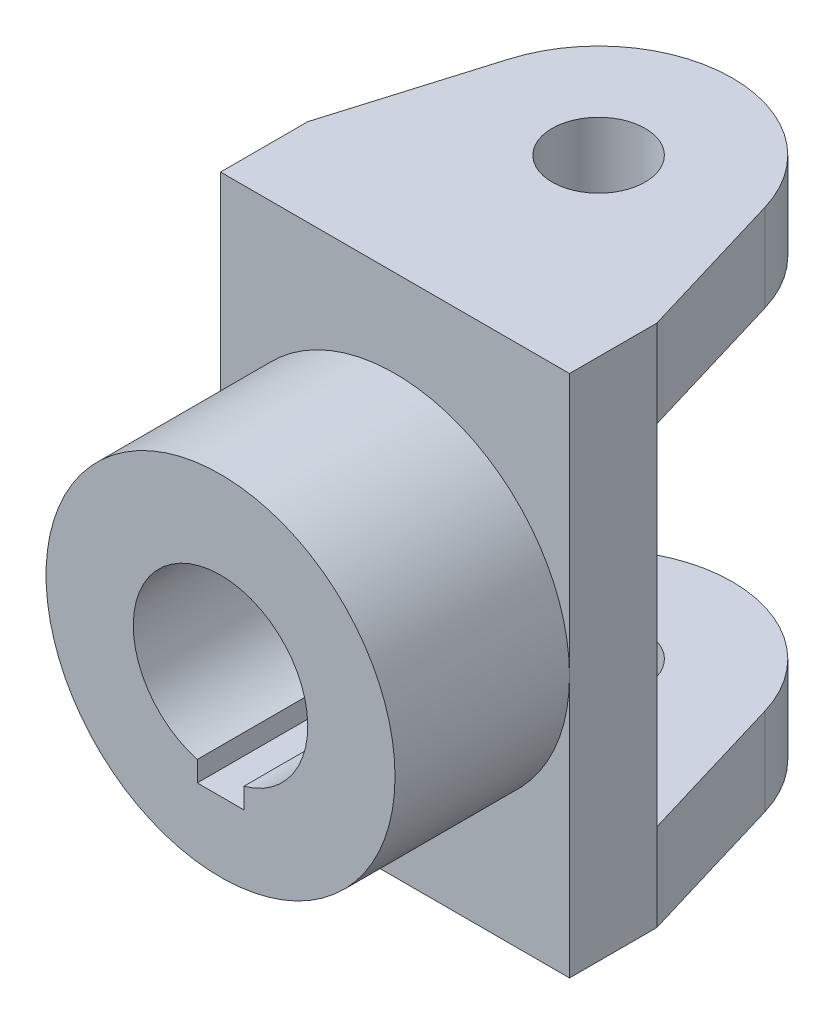
ISO-10303-21;
HEADER;
FILE_DESCRIPTION(('STEP AP214'),'2;1');
FILE_NAME('part.step','',(''),(''),'','','');
FILE_SCHEMA(('AUTOMOTIVE_DESIGN { 1 0 10303 214 1 1 1 1 }'));
ENDSEC;
DATA;
#1=APPLICATION_CONTEXT('core data for automotive mechanical design processes');
#2=APPLICATION_PROTOCOL_DEFINITION('international standard','automotive_design',2000,#1);
#3=PRODUCT_CONTEXT('',#1,'mechanical');
#4=PRODUCT('Part','Part','',(#3));
#5=PRODUCT_RELATED_PRODUCT_CATEGORY('part','',(#4));
#6=PRODUCT_DEFINITION_FORMATION('','',#4);
#7=PRODUCT_DEFINITION_CONTEXT('part definition',#1,'design');
#8=PRODUCT_DEFINITION('design','',#6,#7);
#9=PRODUCT_DEFINITION_SHAPE('','',#8);
#10=(LENGTH_UNIT() NAMED_UNIT(*) SI_UNIT(.MILLI.,.METRE.));
#11=(NAMED_UNIT(*) PLANE_ANGLE_UNIT() SI_UNIT($,.RADIAN.));
#12=(NAMED_UNIT(*) SI_UNIT($,.STERADIAN.) SOLID_ANGLE_UNIT());
#13=UNCERTAINTY_MEASURE_WITH_UNIT(LENGTH_MEASURE(1.E-05),#10,'distance_accuracy_value','');
#14=(GEOMETRIC_REPRESENTATION_CONTEXT(3) GLOBAL_UNCERTAINTY_ASSIGNED_CONTEXT((#13)) GLOBAL_UNIT_ASSIGNED_CONTEXT((#10,
#11,#12)) REPRESENTATION_CONTEXT('',''));
#15=CARTESIAN_POINT('',(0.,0.,0.));
#16=DIRECTION('',(0.,0.,1.));
#17=DIRECTION('',(1.,0.,0.));
#18=AXIS2_PLACEMENT_3D('',#15,#16,#17);
#19=CARTESIAN_POINT('',(0.,0.,-45.));
#20=DIRECTION('',(0.,0.,1.));
#21=DIRECTION('',(1.,0.,0.));
#22=AXIS2_PLACEMENT_3D('',#19,#20,#21);
#23=PLANE('',#22);
#24=DIRECTION('',(1.,0.,0.));
#25=VECTOR('',#24,1.);
#26=CARTESIAN_POINT('',(0.,-30.,-45.));
#27=LINE('',#26,#25);
#28=CARTESIAN_POINT('',(-30.,-30.,-45.));
#29=VERTEX_POINT('',#28);
#30=CARTESIAN_POINT('',(30.,-30.,-45.));
#31=VERTEX_POINT('',#30);
#32=EDGE_CURVE('E11',#29,#31,#27,.T.);
#33=ORIENTED_EDGE('',*,*,#32,.F.);
#34=DIRECTION('',(0.,1.,0.));
#35=VECTOR('',#34,1.);
#36=CARTESIAN_POINT('',(-30.,45.,-45.));
#37=LINE('',#36,#35);
#38=CARTESIAN_POINT('',(-30.,30.,-45.));
#39=VERTEX_POINT('',#38);
#40=EDGE_CURVE('E217',#29,#39,#37,.T.);
#41=ORIENTED_EDGE('',*,*,#40,.T.);
#42=DIRECTION('',(-1.,0.,0.));
#43=VECTOR('',#42,1.);
#44=CARTESIAN_POINT('',(0.,30.,-45.));
#45=LINE('',#44,#43);
#46=CARTESIAN_POINT('',(30.,30.,-45.));
#47=VERTEX_POINT('',#46);
#48=EDGE_CURVE('E50',#47,#39,#45,.T.);
#49=ORIENTED_EDGE('',*,*,#48,.F.);
#50=DIRECTION('',(0.,-1.,0.));
#51=VECTOR('',#50,1.);
#52=CARTESIAN_POINT('',(30.,45.,-45.));
#53=LINE('',#52,#51);
#54=EDGE_CURVE('E218',#47,#31,#53,.T.);
#55=ORIENTED_EDGE('',*,*,#54,.T.);
#56=EDGE_LOOP('',(#33,#41,#49,#55));
#57=FACE_BOUND('',#56,.T.);
#58=ADVANCED_FACE('F39',(#57),#23,.F.);
#59=CARTESIAN_POINT('',(0.,0.,-30.));
#60=DIRECTION('',(0.,0.,1.));
#61=DIRECTION('',(1.,0.,0.));
#62=AXIS2_PLACEMENT_3D('',#59,#60,#61);
#63=CYLINDRICAL_SURFACE('',#62,30.);
#64=CARTESIAN_POINT('',(0.,0.,-30.));
#65=DIRECTION('',(0.,0.,1.));
#66=DIRECTION('',(1.,0.,0.));
#67=AXIS2_PLACEMENT_3D('',#64,#65,#66);
#68=CIRCLE('',#67,30.);
#69=CARTESIAN_POINT('',(30.,0.,-30.));
#70=VERTEX_POINT('',#69);
#71=CARTESIAN_POINT('',(-30.,0.,-30.));
#72=VERTEX_POINT('',#71);
#73=EDGE_CURVE('E277',#70,#72,#68,.T.);
#74=ORIENTED_EDGE('',*,*,#73,.T.);
#75=EDGE_CURVE('E276',#72,#70,#68,.T.);
#76=ORIENTED_EDGE('',*,*,#75,.T.);
#77=EDGE_LOOP('',(#74,#76));
#78=FACE_BOUND('',#77,.T.);
#79=CARTESIAN_POINT('',(0.,0.,0.));
#80=DIRECTION('',(0.,0.,1.));
#81=DIRECTION('',(1.,0.,0.));
#82=AXIS2_PLACEMENT_3D('',#79,#80,#81);
#83=CIRCLE('',#82,30.);
#84=CARTESIAN_POINT('',(30.,0.,0.));
#85=VERTEX_POINT('',#84);
#86=EDGE_CURVE('E267',#85,#85,#83,.T.);
#87=ORIENTED_EDGE('',*,*,#86,.F.);
#88=EDGE_LOOP('',(#87));
#89=FACE_BOUND('',#88,.T.);
#90=ADVANCED_FACE('F41',(#78,#89),#63,.T.);
#91=CARTESIAN_POINT('',(0.,0.,0.));
#92=DIRECTION('',(0.,0.,1.));
#93=DIRECTION('',(1.,0.,0.));
#94=AXIS2_PLACEMENT_3D('',#91,#92,#93);
#95=PLANE('',#94);
#96=CARTESIAN_POINT('',(0.,0.,0.));
#97=DIRECTION('',(0.,0.,1.));
#98=DIRECTION('',(1.,0.,0.));
#99=AXIS2_PLACEMENT_3D('',#96,#97,#98);
#100=CIRCLE('',#99,15.);
#101=CARTESIAN_POINT('',(4.,-14.456832294801,0.));
#102=VERTEX_POINT('',#101);
#103=CARTESIAN_POINT('',(-4.,-14.456832294801,0.));
#104=VERTEX_POINT('',#103);
#105=EDGE_CURVE('E244',#102,#104,#100,.T.);
#106=ORIENTED_EDGE('',*,*,#105,.F.);
#107=DIRECTION('',(0.,1.,0.));
#108=VECTOR('',#107,1.);
#109=CARTESIAN_POINT('',(4.,-14.456832294801,0.));
#110=LINE('',#109,#108);
#111=CARTESIAN_POINT('',(4.,-17.956832294801,0.));
#112=VERTEX_POINT('',#111);
#113=EDGE_CURVE('E247',#112,#102,#110,.T.);
#114=ORIENTED_EDGE('',*,*,#113,.F.);
#115=DIRECTION('',(1.,0.,0.));
#116=VECTOR('',#115,1.);
#117=CARTESIAN_POINT('',(-4.,-17.956832294801,0.));
#118=LINE('',#117,#116);
#119=CARTESIAN_POINT('',(-4.,-17.956832294801,0.));
#120=VERTEX_POINT('',#119);
#121=EDGE_CURVE('E265',#120,#112,#118,.T.);
#122=ORIENTED_EDGE('',*,*,#121,.F.);
#123=DIRECTION('',(0.,-1.,0.));
#124=VECTOR('',#123,1.);
#125=CARTESIAN_POINT('',(-4.,-14.456832294801,0.));
#126=LINE('',#125,#124);
#127=EDGE_CURVE('E259',#104,#120,#126,.T.);
#128=ORIENTED_EDGE('',*,*,#127,.F.);
#129=EDGE_LOOP('',(#106,#114,#122,#128));
#130=FACE_BOUND('',#129,.T.);
#131=ORIENTED_EDGE('',*,*,#86,.T.);
#132=EDGE_LOOP('',(#131));
#133=FACE_BOUND('',#132,.T.);
#134=ADVANCED_FACE('F307',(#130,#133),#95,.T.);
#135=CARTESIAN_POINT('',(0.,0.,-30.));
#136=DIRECTION('',(0.,0.,1.));
#137=DIRECTION('',(1.,0.,0.));
#138=AXIS2_PLACEMENT_3D('',#135,#136,#137);
#139=CYLINDRICAL_SURFACE('',#138,15.);
#140=ORIENTED_EDGE('',*,*,#105,.T.);
#141=DIRECTION('',(0.,0.,1.));
#142=VECTOR('',#141,1.);
#143=CARTESIAN_POINT('',(-4.,-14.456832294801,-30.));
#144=LINE('',#143,#142);
#145=CARTESIAN_POINT('',(-4.,-14.456832294801,-30.));
#146=VERTEX_POINT('',#145);
#147=EDGE_CURVE('E260',#146,#104,#144,.T.);
#148=ORIENTED_EDGE('',*,*,#147,.F.);
#149=CARTESIAN_POINT('',(0.,0.,-30.));
#150=DIRECTION('',(0.,0.,1.));
#151=DIRECTION('',(1.,0.,0.));
#152=AXIS2_PLACEMENT_3D('',#149,#150,#151);
#153=CIRCLE('',#152,15.);
#154=CARTESIAN_POINT('',(4.,-14.456832294801,-30.));
#155=VERTEX_POINT('',#154);
#156=EDGE_CURVE('E241',#155,#146,#153,.T.);
#157=ORIENTED_EDGE('',*,*,#156,.F.);
#158=DIRECTION('',(0.,0.,1.));
#159=VECTOR('',#158,1.);
#160=CARTESIAN_POINT('',(4.,-14.456832294801,-30.));
#161=LINE('',#160,#159);
#162=EDGE_CURVE('E270',#155,#102,#161,.T.);
#163=ORIENTED_EDGE('',*,*,#162,.T.);
#164=EDGE_LOOP('',(#140,#148,#157,#163));
#165=FACE_BOUND('',#164,.T.);
#166=ADVANCED_FACE('F340',(#165),#139,.F.);
#167=CARTESIAN_POINT('',(4.,-14.456832294801,-30.));
#168=DIRECTION('',(1.,0.,0.));
#169=DIRECTION('',(0.,0.,-1.));
#170=AXIS2_PLACEMENT_3D('',#167,#168,#169);
#171=PLANE('',#170);
#172=ORIENTED_EDGE('',*,*,#113,.T.);
#173=ORIENTED_EDGE('',*,*,#162,.F.);
#174=DIRECTION('',(0.,1.,0.));
#175=VECTOR('',#174,1.);
#176=CARTESIAN_POINT('',(4.,-14.456832294801,-30.));
#177=LINE('',#176,#175);
#178=CARTESIAN_POINT('',(4.,-17.956832294801,-30.));
#179=VERTEX_POINT('',#178);
#180=EDGE_CURVE('E255',#179,#155,#177,.T.);
#181=ORIENTED_EDGE('',*,*,#180,.F.);
#182=DIRECTION('',(0.,0.,1.));
#183=VECTOR('',#182,1.);
#184=CARTESIAN_POINT('',(4.,-17.956832294801,-30.));
#185=LINE('',#184,#183);
#186=EDGE_CURVE('E269',#179,#112,#185,.T.);
#187=ORIENTED_EDGE('',*,*,#186,.T.);
#188=EDGE_LOOP('',(#172,#173,#181,#187));
#189=FACE_BOUND('',#188,.T.);
#190=ADVANCED_FACE('F334',(#189),#171,.F.);
#191=CARTESIAN_POINT('',(-4.,-17.956832294801,-30.));
#192=DIRECTION('',(0.,-1.,0.));
#193=DIRECTION('',(0.,0.,-1.));
#194=AXIS2_PLACEMENT_3D('',#191,#192,#193);
#195=PLANE('',#194);
#196=ORIENTED_EDGE('',*,*,#121,.T.);
#197=ORIENTED_EDGE('',*,*,#186,.F.);
#198=DIRECTION('',(1.,0.,0.));
#199=VECTOR('',#198,1.);
#200=CARTESIAN_POINT('',(-4.,-17.956832294801,-30.));
#201=LINE('',#200,#199);
#202=CARTESIAN_POINT('',(-4.,-17.956832294801,-30.));
#203=VERTEX_POINT('',#202);
#204=EDGE_CURVE('E253',#203,#179,#201,.T.);
#205=ORIENTED_EDGE('',*,*,#204,.F.);
#206=DIRECTION('',(0.,0.,1.));
#207=VECTOR('',#206,1.);
#208=CARTESIAN_POINT('',(-4.,-17.956832294801,-30.));
#209=LINE('',#208,#207);
#210=EDGE_CURVE('E275',#203,#120,#209,.T.);
#211=ORIENTED_EDGE('',*,*,#210,.T.);
#212=EDGE_LOOP('',(#196,#197,#205,#211));
#213=FACE_BOUND('',#212,.T.);
#214=ADVANCED_FACE('F337',(#213),#195,.F.);
#215=CARTESIAN_POINT('',(-4.,-14.456832294801,-30.));
#216=DIRECTION('',(-1.,0.,0.));
#217=DIRECTION('',(0.,0.,1.));
#218=AXIS2_PLACEMENT_3D('',#215,#216,#217);
#219=PLANE('',#218);
#220=ORIENTED_EDGE('',*,*,#127,.T.);
#221=ORIENTED_EDGE('',*,*,#210,.F.);
#222=DIRECTION('',(0.,-1.,0.));
#223=VECTOR('',#222,1.);
#224=CARTESIAN_POINT('',(-4.,-14.456832294801,-30.));
#225=LINE('',#224,#223);
#226=EDGE_CURVE('E250',#146,#203,#225,.T.);
#227=ORIENTED_EDGE('',*,*,#226,.F.);
#228=ORIENTED_EDGE('',*,*,#147,.T.);
#229=EDGE_LOOP('',(#220,#221,#227,#228));
#230=FACE_BOUND('',#229,.T.);
#231=ADVANCED_FACE('F325',(#230),#219,.F.);
#232=CARTESIAN_POINT('',(-30.,45.,-45.));
#233=DIRECTION('',(0.,-1.,0.));
#234=DIRECTION('',(1.,0.,0.));
#235=AXIS2_PLACEMENT_3D('',#232,#233,#234);
#236=PLANE('',#235);
#237=DIRECTION('',(1.,0.,0.));
#238=VECTOR('',#237,1.);
#239=CARTESIAN_POINT('',(-30.,45.,-30.));
#240=LINE('',#239,#238);
#241=CARTESIAN_POINT('',(-30.,45.,-30.));
#242=VERTEX_POINT('',#241);
#243=CARTESIAN_POINT('',(30.,45.,-30.));
#244=VERTEX_POINT('',#243);
#245=EDGE_CURVE('E228',#242,#244,#240,.T.);
#246=ORIENTED_EDGE('',*,*,#245,.T.);
#247=DIRECTION('',(0.,0.,1.));
#248=VECTOR('',#247,1.);
#249=CARTESIAN_POINT('',(30.,45.,-45.));
#250=LINE('',#249,#248);
#251=CARTESIAN_POINT('',(30.,45.,-45.));
#252=VERTEX_POINT('',#251);
#253=EDGE_CURVE('E222',#252,#244,#250,.T.);
#254=ORIENTED_EDGE('',*,*,#253,.F.);
#255=DIRECTION('',(-0.286928155857607,0.,-0.957952103905071));
#256=VECTOR('',#255,1.);
#257=CARTESIAN_POINT('',(22.0328983898167,45.,-71.599347584725));
#258=LINE('',#257,#256);
#259=CARTESIAN_POINT('',(22.0328983898167,45.,-71.599347584725));
#260=VERTEX_POINT('',#259);
#261=EDGE_CURVE('E190',#252,#260,#258,.T.);
#262=ORIENTED_EDGE('',*,*,#261,.T.);
#263=CARTESIAN_POINT('',(0.,45.,-65.));
#264=DIRECTION('',(0.,1.,0.));
#265=DIRECTION('',(-1.,0.,0.));
#266=AXIS2_PLACEMENT_3D('',#263,#264,#265);
#267=CIRCLE('',#266,23.);
#268=CARTESIAN_POINT('',(-22.0328983898166,45.,-71.599347584725));
#269=VERTEX_POINT('',#268);
#270=EDGE_CURVE('E201',#260,#269,#267,.T.);
#271=ORIENTED_EDGE('',*,*,#270,.T.);
#272=DIRECTION('',(-0.286928155857607,0.,0.957952103905071));
#273=VECTOR('',#272,1.);
#274=CARTESIAN_POINT('',(-30.,45.,-45.));
#275=LINE('',#274,#273);
#276=CARTESIAN_POINT('',(-30.,45.,-45.));
#277=VERTEX_POINT('',#276);
#278=EDGE_CURVE('E193',#269,#277,#275,.T.);
#279=ORIENTED_EDGE('',*,*,#278,.T.);
#280=DIRECTION('',(0.,0.,1.));
#281=VECTOR('',#280,1.);
#282=CARTESIAN_POINT('',(-30.,45.,-45.));
#283=LINE('',#282,#281);
#284=EDGE_CURVE('E233',#277,#242,#283,.T.);
#285=ORIENTED_EDGE('',*,*,#284,.T.);
#286=EDGE_LOOP('',(#246,#254,#262,#271,#279,#285));
#287=FACE_BOUND('',#286,.T.);
#288=CARTESIAN_POINT('',(0.,45.,-65.));
#289=DIRECTION('',(0.,1.,0.));
#290=DIRECTION('',(-1.,0.,0.));
#291=AXIS2_PLACEMENT_3D('',#288,#289,#290);
#292=CIRCLE('',#291,8.);
#293=CARTESIAN_POINT('',(-8.,45.,-65.));
#294=VERTEX_POINT('',#293);
#295=EDGE_CURVE('E185',#294,#294,#292,.T.);
#296=ORIENTED_EDGE('',*,*,#295,.F.);
#297=EDGE_LOOP('',(#296));
#298=FACE_BOUND('',#297,.T.);
#299=ADVANCED_FACE('F318',(#287,#298),#236,.F.);
#300=CARTESIAN_POINT('',(-30.,45.,-45.));
#301=DIRECTION('',(1.,0.,0.));
#302=DIRECTION('',(0.,1.,0.));
#303=AXIS2_PLACEMENT_3D('',#300,#301,#302);
#304=PLANE('',#303);
#305=ORIENTED_EDGE('',*,*,#40,.F.);
#306=CARTESIAN_POINT('',(-30.,-45.,-45.));
#307=VERTEX_POINT('',#306);
#308=EDGE_CURVE('E167',#307,#29,#37,.T.);
#309=ORIENTED_EDGE('',*,*,#308,.F.);
#310=DIRECTION('',(0.,0.,1.));
#311=VECTOR('',#310,1.);
#312=CARTESIAN_POINT('',(-30.,-45.,-45.));
#313=LINE('',#312,#311);
#314=CARTESIAN_POINT('',(-30.,-45.,-30.));
#315=VERTEX_POINT('',#314);
#316=EDGE_CURVE('E240',#307,#315,#313,.T.);
#317=ORIENTED_EDGE('',*,*,#316,.T.);
#318=DIRECTION('',(0.,1.,0.));
#319=VECTOR('',#318,1.);
#320=CARTESIAN_POINT('',(-30.,45.,-30.));
#321=LINE('',#320,#319);
#322=EDGE_CURVE('E229',#315,#72,#321,.T.);
#323=ORIENTED_EDGE('',*,*,#322,.T.);
#324=EDGE_CURVE('E230',#72,#242,#321,.T.);
#325=ORIENTED_EDGE('',*,*,#324,.T.);
#326=ORIENTED_EDGE('',*,*,#284,.F.);
#327=DIRECTION('',(0.,1.,0.));
#328=VECTOR('',#327,1.);
#329=CARTESIAN_POINT('',(-30.,30.,-45.));
#330=LINE('',#329,#328);
#331=EDGE_CURVE('E208',#39,#277,#330,.T.);
#332=ORIENTED_EDGE('',*,*,#331,.F.);
#333=EDGE_LOOP('',(#305,#309,#317,#323,#325,#326,#332));
#334=FACE_BOUND('',#333,.T.);
#335=ADVANCED_FACE('F321',(#334),#304,.F.);
#336=CARTESIAN_POINT('',(-30.,-45.,-45.));
#337=DIRECTION('',(0.,1.,0.));
#338=DIRECTION('',(-1.,0.,0.));
#339=AXIS2_PLACEMENT_3D('',#336,#337,#338);
#340=PLANE('',#339);
#341=DIRECTION('',(-1.,0.,0.));
#342=VECTOR('',#341,1.);
#343=CARTESIAN_POINT('',(-30.,-45.,-30.));
#344=LINE('',#343,#342);
#345=CARTESIAN_POINT('',(30.,-45.,-30.));
#346=VERTEX_POINT('',#345);
#347=EDGE_CURVE('E223',#346,#315,#344,.T.);
#348=ORIENTED_EDGE('',*,*,#347,.T.);
#349=ORIENTED_EDGE('',*,*,#316,.F.);
#350=DIRECTION('',(-0.286928155857607,0.,0.957952103905071));
#351=VECTOR('',#350,1.);
#352=CARTESIAN_POINT('',(-30.,-45.,-45.));
#353=LINE('',#352,#351);
#354=CARTESIAN_POINT('',(-22.0328983898166,-45.,-71.599347584725));
#355=VERTEX_POINT('',#354);
#356=EDGE_CURVE('E173',#355,#307,#353,.T.);
#357=ORIENTED_EDGE('',*,*,#356,.F.);
#358=CARTESIAN_POINT('',(0.,-45.,-65.));
#359=DIRECTION('',(0.,1.,0.));
#360=DIRECTION('',(-1.,0.,0.));
#361=AXIS2_PLACEMENT_3D('',#358,#359,#360);
#362=CIRCLE('',#361,23.);
#363=CARTESIAN_POINT('',(22.0328983898167,-45.,-71.599347584725));
#364=VERTEX_POINT('',#363);
#365=EDGE_CURVE('E158',#364,#355,#362,.T.);
#366=ORIENTED_EDGE('',*,*,#365,.F.);
#367=DIRECTION('',(-0.286928155857607,0.,-0.957952103905071));
#368=VECTOR('',#367,1.);
#369=CARTESIAN_POINT('',(22.0328983898167,-45.,-71.599347584725));
#370=LINE('',#369,#368);
#371=CARTESIAN_POINT('',(30.,-45.,-45.));
#372=VERTEX_POINT('',#371);
#373=EDGE_CURVE('E170',#372,#364,#370,.T.);
#374=ORIENTED_EDGE('',*,*,#373,.F.);
#375=DIRECTION('',(0.,0.,1.));
#376=VECTOR('',#375,1.);
#377=CARTESIAN_POINT('',(30.,-45.,-45.));
#378=LINE('',#377,#376);
#379=EDGE_CURVE('E238',#372,#346,#378,.T.);
#380=ORIENTED_EDGE('',*,*,#379,.T.);
#381=EDGE_LOOP('',(#348,#349,#357,#366,#374,#380));
#382=FACE_BOUND('',#381,.T.);
#383=CARTESIAN_POINT('',(0.,-45.,-65.));
#384=DIRECTION('',(0.,1.,0.));
#385=DIRECTION('',(-1.,0.,0.));
#386=AXIS2_PLACEMENT_3D('',#383,#384,#385);
#387=CIRCLE('',#386,8.);
#388=CARTESIAN_POINT('',(-8.,-45.,-65.));
#389=VERTEX_POINT('',#388);
#390=EDGE_CURVE('E172',#389,#389,#387,.T.);
#391=ORIENTED_EDGE('',*,*,#390,.T.);
#392=EDGE_LOOP('',(#391));
#393=FACE_BOUND('',#392,.T.);
#394=ADVANCED_FACE('F326',(#382,#393),#340,.F.);
#395=CARTESIAN_POINT('',(30.,45.,-45.));
#396=DIRECTION('',(-1.,0.,0.));
#397=DIRECTION('',(0.,-1.,0.));
#398=AXIS2_PLACEMENT_3D('',#395,#396,#397);
#399=PLANE('',#398);
#400=DIRECTION('',(0.,-1.,0.));
#401=VECTOR('',#400,1.);
#402=CARTESIAN_POINT('',(30.,45.,-30.));
#403=LINE('',#402,#401);
#404=EDGE_CURVE('E211',#70,#346,#403,.T.);
#405=ORIENTED_EDGE('',*,*,#404,.T.);
#406=ORIENTED_EDGE('',*,*,#379,.F.);
#407=DIRECTION('',(0.,-1.,0.));
#408=VECTOR('',#407,1.);
#409=CARTESIAN_POINT('',(30.,-30.,-45.));
#410=LINE('',#409,#408);
#411=EDGE_CURVE('E178',#31,#372,#410,.T.);
#412=ORIENTED_EDGE('',*,*,#411,.F.);
#413=ORIENTED_EDGE('',*,*,#54,.F.);
#414=EDGE_CURVE('E214',#252,#47,#53,.T.);
#415=ORIENTED_EDGE('',*,*,#414,.F.);
#416=ORIENTED_EDGE('',*,*,#253,.T.);
#417=EDGE_CURVE('E225',#244,#70,#403,.T.);
#418=ORIENTED_EDGE('',*,*,#417,.T.);
#419=EDGE_LOOP('',(#405,#406,#412,#413,#415,#416,#418));
#420=FACE_BOUND('',#419,.T.);
#421=ADVANCED_FACE('F299',(#420),#399,.F.);
#422=CARTESIAN_POINT('',(0.,0.,-30.));
#423=DIRECTION('',(0.,0.,1.));
#424=DIRECTION('',(1.,0.,0.));
#425=AXIS2_PLACEMENT_3D('',#422,#423,#424);
#426=PLANE('',#425);
#427=ORIENTED_EDGE('',*,*,#404,.F.);
#428=ORIENTED_EDGE('',*,*,#75,.F.);
#429=ORIENTED_EDGE('',*,*,#322,.F.);
#430=ORIENTED_EDGE('',*,*,#347,.F.);
#431=EDGE_LOOP('',(#427,#428,#429,#430));
#432=FACE_BOUND('',#431,.T.);
#433=ADVANCED_FACE('F320',(#432),#426,.T.);
#434=ORIENTED_EDGE('',*,*,#73,.F.);
#435=ORIENTED_EDGE('',*,*,#417,.F.);
#436=ORIENTED_EDGE('',*,*,#245,.F.);
#437=ORIENTED_EDGE('',*,*,#324,.F.);
#438=EDGE_LOOP('',(#434,#435,#436,#437));
#439=FACE_BOUND('',#438,.T.);
#440=ADVANCED_FACE('F312',(#439),#426,.T.);
#441=ORIENTED_EDGE('',*,*,#204,.T.);
#442=ORIENTED_EDGE('',*,*,#180,.T.);
#443=ORIENTED_EDGE('',*,*,#156,.T.);
#444=ORIENTED_EDGE('',*,*,#226,.T.);
#445=EDGE_LOOP('',(#441,#442,#443,#444));
#446=FACE_BOUND('',#445,.T.);
#447=ADVANCED_FACE('F315',(#446),#426,.T.);
#448=CARTESIAN_POINT('',(0.,30.,-65.));
#449=DIRECTION('',(0.,1.,0.));
#450=DIRECTION('',(-1.,0.,0.));
#451=AXIS2_PLACEMENT_3D('',#448,#449,#450);
#452=PLANE('',#451);
#453=CARTESIAN_POINT('',(0.,30.,-65.));
#454=DIRECTION('',(0.,1.,0.));
#455=DIRECTION('',(-1.,0.,0.));
#456=AXIS2_PLACEMENT_3D('',#453,#454,#455);
#457=CIRCLE('',#456,8.);
#458=CARTESIAN_POINT('',(-8.,30.,-65.));
#459=VERTEX_POINT('',#458);
#460=EDGE_CURVE('E184',#459,#459,#457,.T.);
#461=ORIENTED_EDGE('',*,*,#460,.T.);
#462=EDGE_LOOP('',(#461));
#463=FACE_BOUND('',#462,.T.);
#464=DIRECTION('',(-0.286928155857607,0.,-0.957952103905071));
#465=VECTOR('',#464,1.);
#466=CARTESIAN_POINT('',(22.0328983898166,30.,-71.599347584725));
#467=LINE('',#466,#465);
#468=CARTESIAN_POINT('',(22.0328983898166,30.,-71.599347584725));
#469=VERTEX_POINT('',#468);
#470=EDGE_CURVE('E188',#47,#469,#467,.T.);
#471=ORIENTED_EDGE('',*,*,#470,.F.);
#472=ORIENTED_EDGE('',*,*,#48,.T.);
#473=DIRECTION('',(-0.286928155857607,0.,0.957952103905071));
#474=VECTOR('',#473,1.);
#475=CARTESIAN_POINT('',(-30.,30.,-45.));
#476=LINE('',#475,#474);
#477=CARTESIAN_POINT('',(-22.0328983898166,30.,-71.599347584725));
#478=VERTEX_POINT('',#477);
#479=EDGE_CURVE('E197',#478,#39,#476,.T.);
#480=ORIENTED_EDGE('',*,*,#479,.F.);
#481=CARTESIAN_POINT('',(0.,30.,-65.));
#482=DIRECTION('',(0.,1.,0.));
#483=DIRECTION('',(-1.,0.,0.));
#484=AXIS2_PLACEMENT_3D('',#481,#482,#483);
#485=CIRCLE('',#484,23.);
#486=EDGE_CURVE('E192',#469,#478,#485,.T.);
#487=ORIENTED_EDGE('',*,*,#486,.F.);
#488=EDGE_LOOP('',(#471,#472,#480,#487));
#489=FACE_BOUND('',#488,.T.);
#490=ADVANCED_FACE('F281',(#463,#489),#452,.F.);
#491=CARTESIAN_POINT('',(-30.,30.,-45.));
#492=DIRECTION('',(-0.957952103905071,0.,-0.286928155857607));
#493=DIRECTION('',(-0.286928155857607,0.,0.957952103905072));
#494=AXIS2_PLACEMENT_3D('',#491,#492,#493);
#495=PLANE('',#494);
#496=ORIENTED_EDGE('',*,*,#278,.F.);
#497=DIRECTION('',(0.,1.,0.));
#498=VECTOR('',#497,1.);
#499=CARTESIAN_POINT('',(-22.0328983898166,30.,-71.599347584725));
#500=LINE('',#499,#498);
#501=EDGE_CURVE('E215',#478,#269,#500,.T.);
#502=ORIENTED_EDGE('',*,*,#501,.F.);
#503=ORIENTED_EDGE('',*,*,#479,.T.);
#504=ORIENTED_EDGE('',*,*,#331,.T.);
#505=EDGE_LOOP('',(#496,#502,#503,#504));
#506=FACE_BOUND('',#505,.T.);
#507=ADVANCED_FACE('F287',(#506),#495,.T.);
#508=CARTESIAN_POINT('',(0.,30.,-65.));
#509=DIRECTION('',(0.,1.,0.));
#510=DIRECTION('',(-1.,0.,0.));
#511=AXIS2_PLACEMENT_3D('',#508,#509,#510);
#512=CYLINDRICAL_SURFACE('',#511,23.);
#513=ORIENTED_EDGE('',*,*,#270,.F.);
#514=DIRECTION('',(0.,1.,0.));
#515=VECTOR('',#514,1.);
#516=CARTESIAN_POINT('',(22.0328983898166,30.,-71.599347584725));
#517=LINE('',#516,#515);
#518=EDGE_CURVE('E199',#469,#260,#517,.T.);
#519=ORIENTED_EDGE('',*,*,#518,.F.);
#520=ORIENTED_EDGE('',*,*,#486,.T.);
#521=ORIENTED_EDGE('',*,*,#501,.T.);
#522=EDGE_LOOP('',(#513,#519,#520,#521));
#523=FACE_BOUND('',#522,.T.);
#524=ADVANCED_FACE('F295',(#523),#512,.T.);
#525=CARTESIAN_POINT('',(22.0328983898166,30.,-71.599347584725));
#526=DIRECTION('',(0.957952103905071,0.,-0.286928155857607));
#527=DIRECTION('',(-0.286928155857607,0.,-0.957952103905071));
#528=AXIS2_PLACEMENT_3D('',#525,#526,#527);
#529=PLANE('',#528);
#530=ORIENTED_EDGE('',*,*,#261,.F.);
#531=ORIENTED_EDGE('',*,*,#414,.T.);
#532=ORIENTED_EDGE('',*,*,#470,.T.);
#533=ORIENTED_EDGE('',*,*,#518,.T.);
#534=EDGE_LOOP('',(#530,#531,#532,#533));
#535=FACE_BOUND('',#534,.T.);
#536=ADVANCED_FACE('F293',(#535),#529,.T.);
#537=CARTESIAN_POINT('',(0.,30.,-65.));
#538=DIRECTION('',(0.,1.,0.));
#539=DIRECTION('',(-1.,0.,0.));
#540=AXIS2_PLACEMENT_3D('',#537,#538,#539);
#541=CYLINDRICAL_SURFACE('',#540,8.);
#542=ORIENTED_EDGE('',*,*,#460,.F.);
#543=EDGE_LOOP('',(#542));
#544=FACE_BOUND('',#543,.T.);
#545=ORIENTED_EDGE('',*,*,#295,.T.);
#546=EDGE_LOOP('',(#545));
#547=FACE_BOUND('',#546,.T.);
#548=ADVANCED_FACE('F428',(#544,#547),#541,.F.);
#549=CARTESIAN_POINT('',(0.,-30.,-65.));
#550=DIRECTION('',(0.,-1.,0.));
#551=DIRECTION('',(-1.,0.,0.));
#552=AXIS2_PLACEMENT_3D('',#549,#550,#551);
#553=PLANE('',#552);
#554=CARTESIAN_POINT('',(0.,-30.,-65.));
#555=DIRECTION('',(0.,1.,0.));
#556=DIRECTION('',(-1.,0.,0.));
#557=AXIS2_PLACEMENT_3D('',#554,#555,#556);
#558=CIRCLE('',#557,8.);
#559=CARTESIAN_POINT('',(-8.,-30.,-65.));
#560=VERTEX_POINT('',#559);
#561=EDGE_CURVE('E180',#560,#560,#558,.T.);
#562=ORIENTED_EDGE('',*,*,#561,.F.);
#563=EDGE_LOOP('',(#562));
#564=FACE_BOUND('',#563,.T.);
#565=DIRECTION('',(-0.286928155857607,0.,0.957952103905071));
#566=VECTOR('',#565,1.);
#567=CARTESIAN_POINT('',(-30.,-30.,-45.));
#568=LINE('',#567,#566);
#569=CARTESIAN_POINT('',(-22.0328983898166,-30.,-71.599347584725));
#570=VERTEX_POINT('',#569);
#571=EDGE_CURVE('E148',#570,#29,#568,.T.);
#572=ORIENTED_EDGE('',*,*,#571,.T.);
#573=ORIENTED_EDGE('',*,*,#32,.T.);
#574=DIRECTION('',(-0.286928155857607,0.,-0.957952103905071));
#575=VECTOR('',#574,1.);
#576=CARTESIAN_POINT('',(22.0328983898166,-30.,-71.599347584725));
#577=LINE('',#576,#575);
#578=CARTESIAN_POINT('',(22.0328983898166,-30.,-71.599347584725));
#579=VERTEX_POINT('',#578);
#580=EDGE_CURVE('E149',#31,#579,#577,.T.);
#581=ORIENTED_EDGE('',*,*,#580,.T.);
#582=CARTESIAN_POINT('',(0.,-30.,-65.));
#583=DIRECTION('',(0.,1.,0.));
#584=DIRECTION('',(-1.,0.,0.));
#585=AXIS2_PLACEMENT_3D('',#582,#583,#584);
#586=CIRCLE('',#585,23.);
#587=EDGE_CURVE('E142',#579,#570,#586,.T.);
#588=ORIENTED_EDGE('',*,*,#587,.T.);
#589=EDGE_LOOP('',(#572,#573,#581,#588));
#590=FACE_BOUND('',#589,.T.);
#591=ADVANCED_FACE('F145',(#564,#590),#553,.F.);
#592=CARTESIAN_POINT('',(22.0328983898166,-30.,-71.599347584725));
#593=DIRECTION('',(-0.957952103905071,0.,0.286928155857607));
#594=DIRECTION('',(0.286928155857607,0.,0.957952103905071));
#595=AXIS2_PLACEMENT_3D('',#592,#593,#594);
#596=PLANE('',#595);
#597=ORIENTED_EDGE('',*,*,#373,.T.);
#598=DIRECTION('',(0.,-1.,0.));
#599=VECTOR('',#598,1.);
#600=CARTESIAN_POINT('',(22.0328983898166,-30.,-71.599347584725));
#601=LINE('',#600,#599);
#602=EDGE_CURVE('E165',#579,#364,#601,.T.);
#603=ORIENTED_EDGE('',*,*,#602,.F.);
#604=ORIENTED_EDGE('',*,*,#580,.F.);
#605=ORIENTED_EDGE('',*,*,#411,.T.);
#606=EDGE_LOOP('',(#597,#603,#604,#605));
#607=FACE_BOUND('',#606,.T.);
#608=ADVANCED_FACE('F458',(#607),#596,.F.);
#609=CARTESIAN_POINT('',(0.,-30.,-65.));
#610=DIRECTION('',(0.,-1.,0.));
#611=DIRECTION('',(1.,0.,0.));
#612=AXIS2_PLACEMENT_3D('',#609,#610,#611);
#613=CYLINDRICAL_SURFACE('',#612,23.);
#614=ORIENTED_EDGE('',*,*,#365,.T.);
#615=DIRECTION('',(0.,-1.,0.));
#616=VECTOR('',#615,1.);
#617=CARTESIAN_POINT('',(-22.0328983898166,-30.,-71.599347584725));
#618=LINE('',#617,#616);
#619=EDGE_CURVE('E154',#570,#355,#618,.T.);
#620=ORIENTED_EDGE('',*,*,#619,.F.);
#621=ORIENTED_EDGE('',*,*,#587,.F.);
#622=ORIENTED_EDGE('',*,*,#602,.T.);
#623=EDGE_LOOP('',(#614,#620,#621,#622));
#624=FACE_BOUND('',#623,.T.);
#625=ADVANCED_FACE('F156',(#624),#613,.T.);
#626=CARTESIAN_POINT('',(-30.,-30.,-45.));
#627=DIRECTION('',(0.957952103905071,0.,0.286928155857607));
#628=DIRECTION('',(0.286928155857607,0.,-0.957952103905072));
#629=AXIS2_PLACEMENT_3D('',#626,#627,#628);
#630=PLANE('',#629);
#631=ORIENTED_EDGE('',*,*,#356,.T.);
#632=ORIENTED_EDGE('',*,*,#308,.T.);
#633=ORIENTED_EDGE('',*,*,#571,.F.);
#634=ORIENTED_EDGE('',*,*,#619,.T.);
#635=EDGE_LOOP('',(#631,#632,#633,#634));
#636=FACE_BOUND('',#635,.T.);
#637=ADVANCED_FACE('F163',(#636),#630,.F.);
#638=CARTESIAN_POINT('',(0.,-30.,-65.));
#639=DIRECTION('',(0.,-1.,0.));
#640=DIRECTION('',(1.,0.,0.));
#641=AXIS2_PLACEMENT_3D('',#638,#639,#640);
#642=CYLINDRICAL_SURFACE('',#641,8.);
#643=ORIENTED_EDGE('',*,*,#561,.T.);
#644=EDGE_LOOP('',(#643));
#645=FACE_BOUND('',#644,.T.);
#646=ORIENTED_EDGE('',*,*,#390,.F.);
#647=EDGE_LOOP('',(#646));
#648=FACE_BOUND('',#647,.T.);
#649=ADVANCED_FACE('F488',(#645,#648),#642,.F.);
#650=CLOSED_SHELL('',(#58,#90,#134,#166,#190,#214,#231,#299,#335,#394,#421,#433,#440,#447,#490,
#507,#524,#536,#548,#591,#608,#625,#637,#649));
#651=MANIFOLD_SOLID_BREP('B2',#650);
#652=ADVANCED_BREP_SHAPE_REPRESENTATION('',(#18,#651),#14);
#653=SHAPE_DEFINITION_REPRESENTATION(#9,#652);
ENDSEC;
END-ISO-10303-21;
